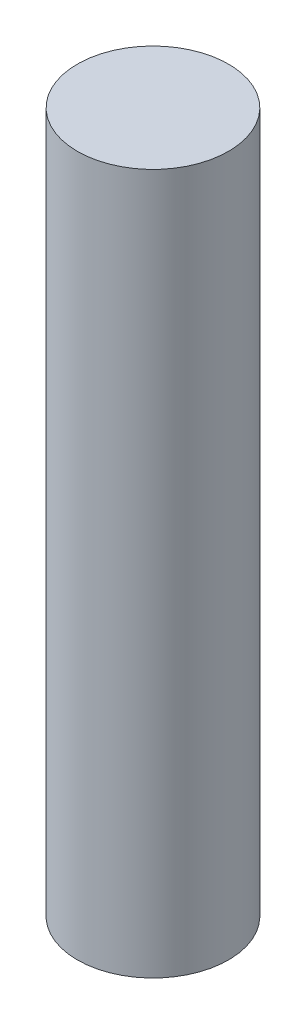
ISO-10303-21;
HEADER;
FILE_DESCRIPTION(('STEP AP214'),'2;1');
FILE_NAME('part.step','',(''),(''),'','','');
FILE_SCHEMA(('AUTOMOTIVE_DESIGN { 1 0 10303 214 1 1 1 1 }'));
ENDSEC;
DATA;
#1=APPLICATION_CONTEXT('core data for automotive mechanical design processes');
#2=APPLICATION_PROTOCOL_DEFINITION('international standard','automotive_design',2000,#1);
#3=PRODUCT_CONTEXT('',#1,'mechanical');
#4=PRODUCT('Part','Part','',(#3));
#5=PRODUCT_RELATED_PRODUCT_CATEGORY('part','',(#4));
#6=PRODUCT_DEFINITION_FORMATION('','',#4);
#7=PRODUCT_DEFINITION_CONTEXT('part definition',#1,'design');
#8=PRODUCT_DEFINITION('design','',#6,#7);
#9=PRODUCT_DEFINITION_SHAPE('','',#8);
#10=(LENGTH_UNIT() NAMED_UNIT(*) SI_UNIT(.MILLI.,.METRE.));
#11=(NAMED_UNIT(*) PLANE_ANGLE_UNIT() SI_UNIT($,.RADIAN.));
#12=(NAMED_UNIT(*) SI_UNIT($,.STERADIAN.) SOLID_ANGLE_UNIT());
#13=UNCERTAINTY_MEASURE_WITH_UNIT(LENGTH_MEASURE(1.E-05),#10,'distance_accuracy_value','');
#14=(GEOMETRIC_REPRESENTATION_CONTEXT(3) GLOBAL_UNCERTAINTY_ASSIGNED_CONTEXT((#13)) GLOBAL_UNIT_ASSIGNED_CONTEXT((#10,
#11,#12)) REPRESENTATION_CONTEXT('',''));
#15=CARTESIAN_POINT('',(0.,0.,0.));
#16=DIRECTION('',(0.,0.,1.));
#17=DIRECTION('',(1.,0.,0.));
#18=AXIS2_PLACEMENT_3D('',#15,#16,#17);
#19=CARTESIAN_POINT('',(0.,40.3,0.));
#20=DIRECTION('',(0.,-1.,0.));
#21=DIRECTION('',(0.,0.,-1.));
#22=AXIS2_PLACEMENT_3D('',#19,#20,#21);
#23=CYLINDRICAL_SURFACE('',#22,4.35);
#24=CARTESIAN_POINT('',(0.,40.3,0.));
#25=DIRECTION('',(0.,1.,0.));
#26=DIRECTION('',(0.,0.,1.));
#27=AXIS2_PLACEMENT_3D('',#24,#25,#26);
#28=CIRCLE('',#27,4.35);
#29=CARTESIAN_POINT('',(0.,40.3,4.35));
#30=VERTEX_POINT('',#29);
#31=EDGE_CURVE('E10',#30,#30,#28,.T.);
#32=ORIENTED_EDGE('',*,*,#31,.F.);
#33=EDGE_LOOP('',(#32));
#34=FACE_BOUND('',#33,.T.);
#35=CARTESIAN_POINT('',(0.,0.,0.));
#36=DIRECTION('',(0.,1.,0.));
#37=DIRECTION('',(0.,0.,1.));
#38=AXIS2_PLACEMENT_3D('',#35,#36,#37);
#39=CIRCLE('',#38,4.35);
#40=CARTESIAN_POINT('',(0.,0.,4.35));
#41=VERTEX_POINT('',#40);
#42=EDGE_CURVE('E34',#41,#41,#39,.T.);
#43=ORIENTED_EDGE('',*,*,#42,.T.);
#44=EDGE_LOOP('',(#43));
#45=FACE_BOUND('',#44,.T.);
#46=ADVANCED_FACE('F31',(#34,#45),#23,.T.);
#47=CARTESIAN_POINT('',(0.,40.3,0.));
#48=DIRECTION('',(0.,1.,0.));
#49=DIRECTION('',(0.,0.,1.));
#50=AXIS2_PLACEMENT_3D('',#47,#48,#49);
#51=PLANE('',#50);
#52=ORIENTED_EDGE('',*,*,#31,.T.);
#53=EDGE_LOOP('',(#52));
#54=FACE_BOUND('',#53,.T.);
#55=ADVANCED_FACE('F46',(#54),#51,.T.);
#56=CARTESIAN_POINT('',(0.,0.,0.));
#57=DIRECTION('',(0.,1.,0.));
#58=DIRECTION('',(0.,0.,1.));
#59=AXIS2_PLACEMENT_3D('',#56,#57,#58);
#60=PLANE('',#59);
#61=ORIENTED_EDGE('',*,*,#42,.F.);
#62=EDGE_LOOP('',(#61));
#63=FACE_BOUND('',#62,.T.);
#64=ADVANCED_FACE('F44',(#63),#60,.F.);
#65=CLOSED_SHELL('',(#46,#55,#64));
#66=MANIFOLD_SOLID_BREP('B2',#65);
#67=ADVANCED_BREP_SHAPE_REPRESENTATION('',(#18,#66),#14);
#68=SHAPE_DEFINITION_REPRESENTATION(#9,#67);
ENDSEC;
END-ISO-10303-21;
